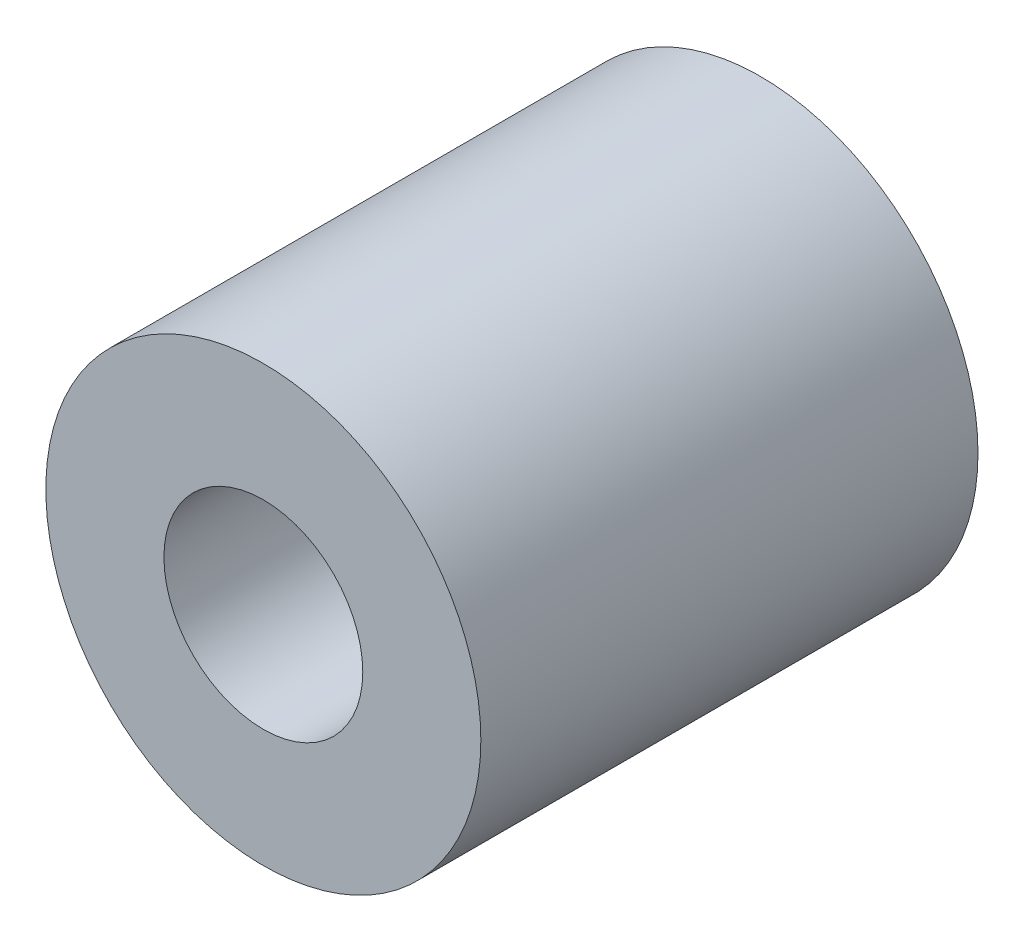
ISO-10303-21;
HEADER;
FILE_DESCRIPTION(('STEP AP214'),'2;1');
FILE_NAME('part.step','',(''),(''),'','','');
FILE_SCHEMA(('AUTOMOTIVE_DESIGN { 1 0 10303 214 1 1 1 1 }'));
ENDSEC;
DATA;
#1=APPLICATION_CONTEXT('core data for automotive mechanical design processes');
#2=APPLICATION_PROTOCOL_DEFINITION('international standard','automotive_design',2000,#1);
#3=PRODUCT_CONTEXT('',#1,'mechanical');
#4=PRODUCT('Part','Part','',(#3));
#5=PRODUCT_RELATED_PRODUCT_CATEGORY('part','',(#4));
#6=PRODUCT_DEFINITION_FORMATION('','',#4);
#7=PRODUCT_DEFINITION_CONTEXT('part definition',#1,'design');
#8=PRODUCT_DEFINITION('design','',#6,#7);
#9=PRODUCT_DEFINITION_SHAPE('','',#8);
#10=(LENGTH_UNIT() NAMED_UNIT(*) SI_UNIT(.MILLI.,.METRE.));
#11=(NAMED_UNIT(*) PLANE_ANGLE_UNIT() SI_UNIT($,.RADIAN.));
#12=(NAMED_UNIT(*) SI_UNIT($,.STERADIAN.) SOLID_ANGLE_UNIT());
#13=UNCERTAINTY_MEASURE_WITH_UNIT(LENGTH_MEASURE(1.E-05),#10,'distance_accuracy_value','');
#14=(GEOMETRIC_REPRESENTATION_CONTEXT(3) GLOBAL_UNCERTAINTY_ASSIGNED_CONTEXT((#13)) GLOBAL_UNIT_ASSIGNED_CONTEXT((#10,
#11,#12)) REPRESENTATION_CONTEXT('',''));
#15=CARTESIAN_POINT('',(0.,0.,0.));
#16=DIRECTION('',(0.,0.,1.));
#17=DIRECTION('',(1.,0.,0.));
#18=AXIS2_PLACEMENT_3D('',#15,#16,#17);
#19=CARTESIAN_POINT('',(0.,0.,8.));
#20=DIRECTION('',(0.,0.,1.));
#21=DIRECTION('',(1.,0.,0.));
#22=AXIS2_PLACEMENT_3D('',#19,#20,#21);
#23=PLANE('',#22);
#24=CARTESIAN_POINT('',(0.,0.,8.));
#25=DIRECTION('',(0.,0.,1.));
#26=DIRECTION('',(1.,0.,0.));
#27=AXIS2_PLACEMENT_3D('',#24,#25,#26);
#28=CIRCLE('',#27,3.5);
#29=CARTESIAN_POINT('',(3.5,0.,8.));
#30=VERTEX_POINT('',#29);
#31=EDGE_CURVE('E10',#30,#30,#28,.T.);
#32=ORIENTED_EDGE('',*,*,#31,.T.);
#33=EDGE_LOOP('',(#32));
#34=FACE_BOUND('',#33,.T.);
#35=CARTESIAN_POINT('',(0.,0.,8.));
#36=DIRECTION('',(0.,0.,1.));
#37=DIRECTION('',(1.,0.,0.));
#38=AXIS2_PLACEMENT_3D('',#35,#36,#37);
#39=CIRCLE('',#38,1.6);
#40=CARTESIAN_POINT('',(1.6,0.,8.));
#41=VERTEX_POINT('',#40);
#42=EDGE_CURVE('E46',#41,#41,#39,.T.);
#43=ORIENTED_EDGE('',*,*,#42,.F.);
#44=EDGE_LOOP('',(#43));
#45=FACE_BOUND('',#44,.T.);
#46=ADVANCED_FACE('F35',(#34,#45),#23,.T.);
#47=CARTESIAN_POINT('',(0.,0.,0.));
#48=DIRECTION('',(0.,0.,1.));
#49=DIRECTION('',(1.,0.,0.));
#50=AXIS2_PLACEMENT_3D('',#47,#48,#49);
#51=PLANE('',#50);
#52=CARTESIAN_POINT('',(0.,0.,0.));
#53=DIRECTION('',(0.,0.,1.));
#54=DIRECTION('',(1.,0.,0.));
#55=AXIS2_PLACEMENT_3D('',#52,#53,#54);
#56=CIRCLE('',#55,3.5);
#57=CARTESIAN_POINT('',(3.5,0.,0.));
#58=VERTEX_POINT('',#57);
#59=EDGE_CURVE('E39',#58,#58,#56,.T.);
#60=ORIENTED_EDGE('',*,*,#59,.F.);
#61=EDGE_LOOP('',(#60));
#62=FACE_BOUND('',#61,.T.);
#63=CARTESIAN_POINT('',(0.,0.,0.));
#64=DIRECTION('',(0.,0.,1.));
#65=DIRECTION('',(1.,0.,0.));
#66=AXIS2_PLACEMENT_3D('',#63,#64,#65);
#67=CIRCLE('',#66,1.6);
#68=CARTESIAN_POINT('',(1.6,0.,0.));
#69=VERTEX_POINT('',#68);
#70=EDGE_CURVE('E48',#69,#69,#67,.T.);
#71=ORIENTED_EDGE('',*,*,#70,.T.);
#72=EDGE_LOOP('',(#71));
#73=FACE_BOUND('',#72,.T.);
#74=ADVANCED_FACE('F58',(#62,#73),#51,.F.);
#75=CARTESIAN_POINT('',(0.,0.,8.));
#76=DIRECTION('',(0.,0.,-1.));
#77=DIRECTION('',(-1.,0.,0.));
#78=AXIS2_PLACEMENT_3D('',#75,#76,#77);
#79=CYLINDRICAL_SURFACE('',#78,3.5);
#80=ORIENTED_EDGE('',*,*,#31,.F.);
#81=EDGE_LOOP('',(#80));
#82=FACE_BOUND('',#81,.T.);
#83=ORIENTED_EDGE('',*,*,#59,.T.);
#84=EDGE_LOOP('',(#83));
#85=FACE_BOUND('',#84,.T.);
#86=ADVANCED_FACE('F37',(#82,#85),#79,.T.);
#87=CARTESIAN_POINT('',(0.,0.,8.));
#88=DIRECTION('',(0.,0.,-1.));
#89=DIRECTION('',(-1.,0.,0.));
#90=AXIS2_PLACEMENT_3D('',#87,#88,#89);
#91=CYLINDRICAL_SURFACE('',#90,1.6);
#92=ORIENTED_EDGE('',*,*,#42,.T.);
#93=EDGE_LOOP('',(#92));
#94=FACE_BOUND('',#93,.T.);
#95=ORIENTED_EDGE('',*,*,#70,.F.);
#96=EDGE_LOOP('',(#95));
#97=FACE_BOUND('',#96,.T.);
#98=ADVANCED_FACE('F54',(#94,#97),#91,.F.);
#99=CLOSED_SHELL('',(#46,#74,#86,#98));
#100=MANIFOLD_SOLID_BREP('B2',#99);
#101=ADVANCED_BREP_SHAPE_REPRESENTATION('',(#18,#100),#14);
#102=SHAPE_DEFINITION_REPRESENTATION(#9,#101);
ENDSEC;
END-ISO-10303-21;
